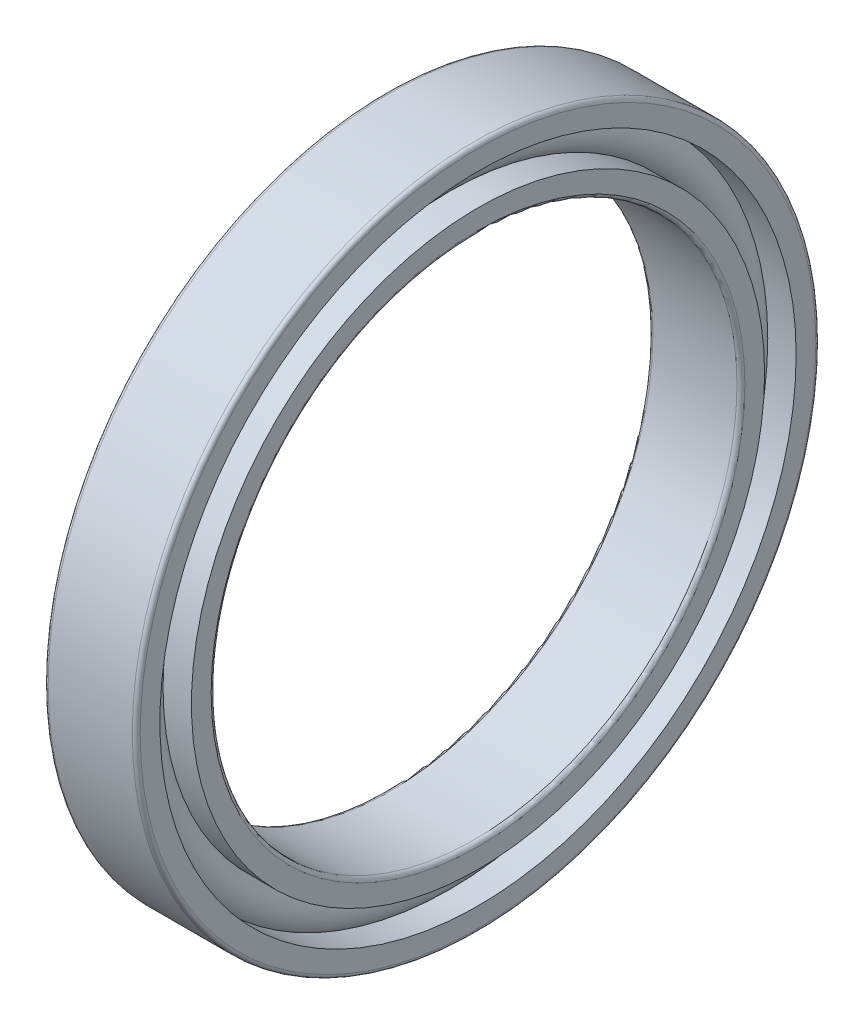
ISO-10303-21;
HEADER;
FILE_DESCRIPTION(('STEP AP214'),'2;1');
FILE_NAME('part.step','',(''),(''),'','','');
FILE_SCHEMA(('AUTOMOTIVE_DESIGN { 1 0 10303 214 1 1 1 1 }'));
ENDSEC;
DATA;
#1=APPLICATION_CONTEXT('core data for automotive mechanical design processes');
#2=APPLICATION_PROTOCOL_DEFINITION('international standard','automotive_design',2000,#1);
#3=PRODUCT_CONTEXT('',#1,'mechanical');
#4=PRODUCT('Part','Part','',(#3));
#5=PRODUCT_RELATED_PRODUCT_CATEGORY('part','',(#4));
#6=PRODUCT_DEFINITION_FORMATION('','',#4);
#7=PRODUCT_DEFINITION_CONTEXT('part definition',#1,'design');
#8=PRODUCT_DEFINITION('design','',#6,#7);
#9=PRODUCT_DEFINITION_SHAPE('','',#8);
#10=(LENGTH_UNIT() NAMED_UNIT(*) SI_UNIT(.MILLI.,.METRE.));
#11=(NAMED_UNIT(*) PLANE_ANGLE_UNIT() SI_UNIT($,.RADIAN.));
#12=(NAMED_UNIT(*) SI_UNIT($,.STERADIAN.) SOLID_ANGLE_UNIT());
#13=UNCERTAINTY_MEASURE_WITH_UNIT(LENGTH_MEASURE(1.E-05),#10,'distance_accuracy_value','');
#14=(GEOMETRIC_REPRESENTATION_CONTEXT(3) GLOBAL_UNCERTAINTY_ASSIGNED_CONTEXT((#13)) GLOBAL_UNIT_ASSIGNED_CONTEXT((#10,
#11,#12)) REPRESENTATION_CONTEXT('',''));
#15=CARTESIAN_POINT('',(0.,0.,0.));
#16=DIRECTION('',(0.,0.,1.));
#17=DIRECTION('',(1.,0.,0.));
#18=AXIS2_PLACEMENT_3D('',#15,#16,#17);
#19=CARTESIAN_POINT('',(0.,0.,0.));
#20=DIRECTION('',(-1.,0.,0.));
#21=DIRECTION('',(0.,0.,1.));
#22=AXIS2_PLACEMENT_3D('',#19,#20,#21);
#23=TOROIDAL_SURFACE('',#22,23.,1.8);
#24=CARTESIAN_POINT('',(1.34164078649987,0.,0.));
#25=DIRECTION('',(-1.,0.,0.));
#26=DIRECTION('',(0.,0.,1.));
#27=AXIS2_PLACEMENT_3D('',#24,#25,#26);
#28=CIRCLE('',#27,24.2);
#29=CARTESIAN_POINT('',(1.34164078649987,0.,24.2));
#30=VERTEX_POINT('',#29);
#31=EDGE_CURVE('E34',#30,#30,#28,.F.);
#32=ORIENTED_EDGE('',*,*,#31,.T.);
#33=EDGE_LOOP('',(#32));
#34=FACE_BOUND('',#33,.T.);
#35=CARTESIAN_POINT('',(1.34164078649987,0.,0.));
#36=DIRECTION('',(-1.,0.,0.));
#37=DIRECTION('',(0.,0.,1.));
#38=AXIS2_PLACEMENT_3D('',#35,#36,#37);
#39=CIRCLE('',#38,21.8);
#40=CARTESIAN_POINT('',(1.34164078649987,0.,21.8));
#41=VERTEX_POINT('',#40);
#42=EDGE_CURVE('E10',#41,#41,#39,.T.);
#43=ORIENTED_EDGE('',*,*,#42,.T.);
#44=EDGE_LOOP('',(#43));
#45=FACE_BOUND('',#44,.T.);
#46=ADVANCED_FACE('F30',(#34,#45),#23,.T.);
#47=CARTESIAN_POINT('',(-20.6375,0.,0.));
#48=DIRECTION('',(1.,0.,0.));
#49=DIRECTION('',(0.,0.,-1.));
#50=AXIS2_PLACEMENT_3D('',#47,#48,#49);
#51=CYLINDRICAL_SURFACE('',#50,21.8);
#52=CARTESIAN_POINT('',(3.5,0.,0.));
#53=DIRECTION('',(1.,0.,0.));
#54=DIRECTION('',(0.,0.,-1.));
#55=AXIS2_PLACEMENT_3D('',#52,#53,#54);
#56=CIRCLE('',#55,21.8);
#57=CARTESIAN_POINT('',(3.5,0.,-21.8));
#58=VERTEX_POINT('',#57);
#59=EDGE_CURVE('E43',#58,#58,#56,.T.);
#60=ORIENTED_EDGE('',*,*,#59,.F.);
#61=EDGE_LOOP('',(#60));
#62=FACE_BOUND('',#61,.T.);
#63=ORIENTED_EDGE('',*,*,#42,.F.);
#64=EDGE_LOOP('',(#63));
#65=FACE_BOUND('',#64,.T.);
#66=ADVANCED_FACE('F82',(#62,#65),#51,.T.);
#67=CARTESIAN_POINT('',(-20.6375,0.,0.));
#68=DIRECTION('',(1.,0.,0.));
#69=DIRECTION('',(0.,0.,-1.));
#70=AXIS2_PLACEMENT_3D('',#67,#68,#69);
#71=CYLINDRICAL_SURFACE('',#70,21.8);
#72=CARTESIAN_POINT('',(-3.5,0.,0.));
#73=DIRECTION('',(1.,0.,0.));
#74=DIRECTION('',(0.,0.,-1.));
#75=AXIS2_PLACEMENT_3D('',#72,#73,#74);
#76=CIRCLE('',#75,21.8);
#77=CARTESIAN_POINT('',(-3.5,0.,-21.8));
#78=VERTEX_POINT('',#77);
#79=EDGE_CURVE('E52',#78,#78,#76,.T.);
#80=ORIENTED_EDGE('',*,*,#79,.T.);
#81=EDGE_LOOP('',(#80));
#82=FACE_BOUND('',#81,.T.);
#83=CARTESIAN_POINT('',(-1.34164078649987,0.,0.));
#84=DIRECTION('',(1.,0.,0.));
#85=DIRECTION('',(0.,0.,-1.));
#86=AXIS2_PLACEMENT_3D('',#83,#84,#85);
#87=CIRCLE('',#86,21.8);
#88=CARTESIAN_POINT('',(-1.34164078649987,0.,-21.8));
#89=VERTEX_POINT('',#88);
#90=EDGE_CURVE('E38',#89,#89,#87,.T.);
#91=ORIENTED_EDGE('',*,*,#90,.F.);
#92=EDGE_LOOP('',(#91));
#93=FACE_BOUND('',#92,.T.);
#94=ADVANCED_FACE('F85',(#82,#93),#71,.T.);
#95=CARTESIAN_POINT('',(3.5,20.3,0.));
#96=DIRECTION('',(1.,0.,0.));
#97=DIRECTION('',(0.,0.,-1.));
#98=AXIS2_PLACEMENT_3D('',#95,#96,#97);
#99=PLANE('',#98);
#100=ORIENTED_EDGE('',*,*,#59,.T.);
#101=EDGE_LOOP('',(#100));
#102=FACE_BOUND('',#101,.T.);
#103=CARTESIAN_POINT('',(3.5,0.,0.));
#104=DIRECTION('',(1.,0.,0.));
#105=DIRECTION('',(0.,0.,-1.));
#106=AXIS2_PLACEMENT_3D('',#103,#104,#105);
#107=CIRCLE('',#106,20.3);
#108=CARTESIAN_POINT('',(3.5,0.,-20.3));
#109=VERTEX_POINT('',#108);
#110=EDGE_CURVE('E74',#109,#109,#107,.T.);
#111=ORIENTED_EDGE('',*,*,#110,.F.);
#112=EDGE_LOOP('',(#111));
#113=FACE_BOUND('',#112,.T.);
#114=ADVANCED_FACE('F79',(#102,#113),#99,.T.);
#115=CARTESIAN_POINT('',(3.2,0.,0.));
#116=DIRECTION('',(1.,0.,0.));
#117=DIRECTION('',(0.,0.,-1.));
#118=AXIS2_PLACEMENT_3D('',#115,#116,#117);
#119=TOROIDAL_SURFACE('',#118,20.3,0.300000000000001);
#120=ORIENTED_EDGE('',*,*,#110,.T.);
#121=EDGE_LOOP('',(#120));
#122=FACE_BOUND('',#121,.T.);
#123=CARTESIAN_POINT('',(3.2,0.,0.));
#124=DIRECTION('',(1.,0.,0.));
#125=DIRECTION('',(0.,0.,-1.));
#126=AXIS2_PLACEMENT_3D('',#123,#124,#125);
#127=CIRCLE('',#126,20.);
#128=CARTESIAN_POINT('',(3.2,0.,-20.));
#129=VERTEX_POINT('',#128);
#130=EDGE_CURVE('E71',#129,#129,#127,.T.);
#131=ORIENTED_EDGE('',*,*,#130,.F.);
#132=EDGE_LOOP('',(#131));
#133=FACE_BOUND('',#132,.T.);
#134=ADVANCED_FACE('F96',(#122,#133),#119,.T.);
#135=CARTESIAN_POINT('',(-20.6375,0.,0.));
#136=DIRECTION('',(1.,0.,0.));
#137=DIRECTION('',(0.,0.,-1.));
#138=AXIS2_PLACEMENT_3D('',#135,#136,#137);
#139=CYLINDRICAL_SURFACE('',#138,20.);
#140=ORIENTED_EDGE('',*,*,#130,.T.);
#141=EDGE_LOOP('',(#140));
#142=FACE_BOUND('',#141,.T.);
#143=CARTESIAN_POINT('',(-3.2,0.,0.));
#144=DIRECTION('',(1.,0.,0.));
#145=DIRECTION('',(0.,0.,-1.));
#146=AXIS2_PLACEMENT_3D('',#143,#144,#145);
#147=CIRCLE('',#146,20.);
#148=CARTESIAN_POINT('',(-3.2,0.,-20.));
#149=VERTEX_POINT('',#148);
#150=EDGE_CURVE('E68',#149,#149,#147,.T.);
#151=ORIENTED_EDGE('',*,*,#150,.F.);
#152=EDGE_LOOP('',(#151));
#153=FACE_BOUND('',#152,.T.);
#154=ADVANCED_FACE('F99',(#142,#153),#139,.F.);
#155=CARTESIAN_POINT('',(-3.2,0.,0.));
#156=DIRECTION('',(1.,0.,0.));
#157=DIRECTION('',(0.,0.,-1.));
#158=AXIS2_PLACEMENT_3D('',#155,#156,#157);
#159=TOROIDAL_SURFACE('',#158,20.3,0.300000000000001);
#160=ORIENTED_EDGE('',*,*,#150,.T.);
#161=EDGE_LOOP('',(#160));
#162=FACE_BOUND('',#161,.T.);
#163=CARTESIAN_POINT('',(-3.5,0.,0.));
#164=DIRECTION('',(1.,0.,0.));
#165=DIRECTION('',(0.,0.,-1.));
#166=AXIS2_PLACEMENT_3D('',#163,#164,#165);
#167=CIRCLE('',#166,20.3);
#168=CARTESIAN_POINT('',(-3.5,0.,-20.3));
#169=VERTEX_POINT('',#168);
#170=EDGE_CURVE('E65',#169,#169,#167,.T.);
#171=ORIENTED_EDGE('',*,*,#170,.F.);
#172=EDGE_LOOP('',(#171));
#173=FACE_BOUND('',#172,.T.);
#174=ADVANCED_FACE('F103',(#162,#173),#159,.T.);
#175=CARTESIAN_POINT('',(-3.5,21.8,0.));
#176=DIRECTION('',(-1.,0.,0.));
#177=DIRECTION('',(0.,0.,1.));
#178=AXIS2_PLACEMENT_3D('',#175,#176,#177);
#179=PLANE('',#178);
#180=ORIENTED_EDGE('',*,*,#170,.T.);
#181=EDGE_LOOP('',(#180));
#182=FACE_BOUND('',#181,.T.);
#183=ORIENTED_EDGE('',*,*,#79,.F.);
#184=EDGE_LOOP('',(#183));
#185=FACE_BOUND('',#184,.T.);
#186=ADVANCED_FACE('F107',(#182,#185),#179,.T.);
#187=CARTESIAN_POINT('',(-1.34164078649987,0.,0.));
#188=DIRECTION('',(1.,0.,0.));
#189=DIRECTION('',(0.,0.,-1.));
#190=AXIS2_PLACEMENT_3D('',#187,#188,#189);
#191=CIRCLE('',#190,24.2);
#192=CARTESIAN_POINT('',(-1.34164078649987,0.,-24.2));
#193=VERTEX_POINT('',#192);
#194=EDGE_CURVE('E46',#193,#193,#191,.F.);
#195=ORIENTED_EDGE('',*,*,#194,.T.);
#196=EDGE_LOOP('',(#195));
#197=FACE_BOUND('',#196,.T.);
#198=ORIENTED_EDGE('',*,*,#90,.T.);
#199=EDGE_LOOP('',(#198));
#200=FACE_BOUND('',#199,.T.);
#201=ADVANCED_FACE('F32',(#197,#200),#23,.T.);
#202=CARTESIAN_POINT('',(-20.6375,0.,0.));
#203=DIRECTION('',(1.,0.,0.));
#204=DIRECTION('',(0.,0.,-1.));
#205=AXIS2_PLACEMENT_3D('',#202,#203,#204);
#206=CYLINDRICAL_SURFACE('',#205,24.2);
#207=CARTESIAN_POINT('',(3.5,0.,0.));
#208=DIRECTION('',(1.,0.,0.));
#209=DIRECTION('',(0.,0.,-1.));
#210=AXIS2_PLACEMENT_3D('',#207,#208,#209);
#211=CIRCLE('',#210,24.2);
#212=CARTESIAN_POINT('',(3.5,0.,-24.2));
#213=VERTEX_POINT('',#212);
#214=EDGE_CURVE('E48',#213,#213,#211,.T.);
#215=ORIENTED_EDGE('',*,*,#214,.T.);
#216=EDGE_LOOP('',(#215));
#217=FACE_BOUND('',#216,.T.);
#218=ORIENTED_EDGE('',*,*,#31,.F.);
#219=EDGE_LOOP('',(#218));
#220=FACE_BOUND('',#219,.T.);
#221=ADVANCED_FACE('F112',(#217,#220),#206,.F.);
#222=CARTESIAN_POINT('',(-20.6375,0.,0.));
#223=DIRECTION('',(1.,0.,0.));
#224=DIRECTION('',(0.,0.,-1.));
#225=AXIS2_PLACEMENT_3D('',#222,#223,#224);
#226=CYLINDRICAL_SURFACE('',#225,24.2);
#227=CARTESIAN_POINT('',(-3.5,0.,0.));
#228=DIRECTION('',(1.,0.,0.));
#229=DIRECTION('',(0.,0.,-1.));
#230=AXIS2_PLACEMENT_3D('',#227,#228,#229);
#231=CIRCLE('',#230,24.2);
#232=CARTESIAN_POINT('',(-3.5,0.,-24.2));
#233=VERTEX_POINT('',#232);
#234=EDGE_CURVE('E143',#233,#233,#231,.T.);
#235=ORIENTED_EDGE('',*,*,#234,.F.);
#236=EDGE_LOOP('',(#235));
#237=FACE_BOUND('',#236,.T.);
#238=ORIENTED_EDGE('',*,*,#194,.F.);
#239=EDGE_LOOP('',(#238));
#240=FACE_BOUND('',#239,.T.);
#241=ADVANCED_FACE('F115',(#237,#240),#226,.F.);
#242=CARTESIAN_POINT('',(3.5,25.7,0.));
#243=DIRECTION('',(1.,0.,0.));
#244=DIRECTION('',(0.,0.,-1.));
#245=AXIS2_PLACEMENT_3D('',#242,#243,#244);
#246=PLANE('',#245);
#247=CARTESIAN_POINT('',(3.5,0.,0.));
#248=DIRECTION('',(1.,0.,0.));
#249=DIRECTION('',(0.,0.,-1.));
#250=AXIS2_PLACEMENT_3D('',#247,#248,#249);
#251=CIRCLE('',#250,25.7);
#252=CARTESIAN_POINT('',(3.5,0.,-25.7));
#253=VERTEX_POINT('',#252);
#254=EDGE_CURVE('E54',#253,#253,#251,.T.);
#255=ORIENTED_EDGE('',*,*,#254,.T.);
#256=EDGE_LOOP('',(#255));
#257=FACE_BOUND('',#256,.T.);
#258=ORIENTED_EDGE('',*,*,#214,.F.);
#259=EDGE_LOOP('',(#258));
#260=FACE_BOUND('',#259,.T.);
#261=ADVANCED_FACE('F116',(#257,#260),#246,.T.);
#262=CARTESIAN_POINT('',(3.2,0.,0.));
#263=DIRECTION('',(1.,0.,0.));
#264=DIRECTION('',(0.,0.,-1.));
#265=AXIS2_PLACEMENT_3D('',#262,#263,#264);
#266=TOROIDAL_SURFACE('',#265,25.7,0.300000000000001);
#267=CARTESIAN_POINT('',(3.2,0.,0.));
#268=DIRECTION('',(1.,0.,0.));
#269=DIRECTION('',(0.,0.,-1.));
#270=AXIS2_PLACEMENT_3D('',#267,#268,#269);
#271=CIRCLE('',#270,26.);
#272=CARTESIAN_POINT('',(3.2,0.,-26.));
#273=VERTEX_POINT('',#272);
#274=EDGE_CURVE('E59',#273,#273,#271,.T.);
#275=ORIENTED_EDGE('',*,*,#274,.T.);
#276=EDGE_LOOP('',(#275));
#277=FACE_BOUND('',#276,.T.);
#278=ORIENTED_EDGE('',*,*,#254,.F.);
#279=EDGE_LOOP('',(#278));
#280=FACE_BOUND('',#279,.T.);
#281=ADVANCED_FACE('F119',(#277,#280),#266,.T.);
#282=CARTESIAN_POINT('',(-20.6375,0.,0.));
#283=DIRECTION('',(1.,0.,0.));
#284=DIRECTION('',(0.,0.,-1.));
#285=AXIS2_PLACEMENT_3D('',#282,#283,#284);
#286=CYLINDRICAL_SURFACE('',#285,26.);
#287=CARTESIAN_POINT('',(-3.2,0.,0.));
#288=DIRECTION('',(1.,0.,0.));
#289=DIRECTION('',(0.,0.,-1.));
#290=AXIS2_PLACEMENT_3D('',#287,#288,#289);
#291=CIRCLE('',#290,26.);
#292=CARTESIAN_POINT('',(-3.2,0.,-26.));
#293=VERTEX_POINT('',#292);
#294=EDGE_CURVE('E147',#293,#293,#291,.T.);
#295=ORIENTED_EDGE('',*,*,#294,.T.);
#296=EDGE_LOOP('',(#295));
#297=FACE_BOUND('',#296,.T.);
#298=ORIENTED_EDGE('',*,*,#274,.F.);
#299=EDGE_LOOP('',(#298));
#300=FACE_BOUND('',#299,.T.);
#301=ADVANCED_FACE('F123',(#297,#300),#286,.T.);
#302=CARTESIAN_POINT('',(-3.2,0.,0.));
#303=DIRECTION('',(1.,0.,0.));
#304=DIRECTION('',(0.,0.,-1.));
#305=AXIS2_PLACEMENT_3D('',#302,#303,#304);
#306=TOROIDAL_SURFACE('',#305,25.7,0.300000000000001);
#307=CARTESIAN_POINT('',(-3.5,0.,0.));
#308=DIRECTION('',(1.,0.,0.));
#309=DIRECTION('',(0.,0.,-1.));
#310=AXIS2_PLACEMENT_3D('',#307,#308,#309);
#311=CIRCLE('',#310,25.7);
#312=CARTESIAN_POINT('',(-3.5,0.,-25.7));
#313=VERTEX_POINT('',#312);
#314=EDGE_CURVE('E144',#313,#313,#311,.T.);
#315=ORIENTED_EDGE('',*,*,#314,.T.);
#316=EDGE_LOOP('',(#315));
#317=FACE_BOUND('',#316,.T.);
#318=ORIENTED_EDGE('',*,*,#294,.F.);
#319=EDGE_LOOP('',(#318));
#320=FACE_BOUND('',#319,.T.);
#321=ADVANCED_FACE('F127',(#317,#320),#306,.T.);
#322=CARTESIAN_POINT('',(-3.5,24.2,0.));
#323=DIRECTION('',(-1.,0.,0.));
#324=DIRECTION('',(0.,0.,1.));
#325=AXIS2_PLACEMENT_3D('',#322,#323,#324);
#326=PLANE('',#325);
#327=ORIENTED_EDGE('',*,*,#234,.T.);
#328=EDGE_LOOP('',(#327));
#329=FACE_BOUND('',#328,.T.);
#330=ORIENTED_EDGE('',*,*,#314,.F.);
#331=EDGE_LOOP('',(#330));
#332=FACE_BOUND('',#331,.T.);
#333=ADVANCED_FACE('F131',(#329,#332),#326,.T.);
#334=CLOSED_SHELL('',(#46,#66,#94,#114,#134,#154,#174,#186,#201,#221,#241,#261,#281,#301,#321,#333));
#335=MANIFOLD_SOLID_BREP('B2',#334);
#336=ADVANCED_BREP_SHAPE_REPRESENTATION('',(#18,#335),#14);
#337=SHAPE_DEFINITION_REPRESENTATION(#9,#336);
ENDSEC;
END-ISO-10303-21;
